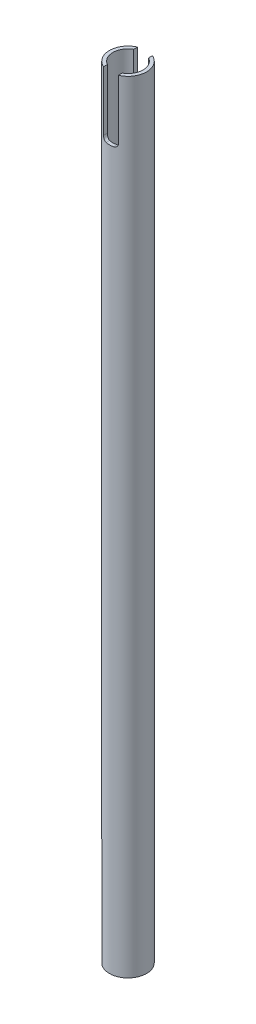
ISO-10303-21;
HEADER;
FILE_DESCRIPTION(('STEP AP214'),'2;1');
FILE_NAME('part.step','',(''),(''),'','','');
FILE_SCHEMA(('AUTOMOTIVE_DESIGN { 1 0 10303 214 1 1 1 1 }'));
ENDSEC;
DATA;
#1=APPLICATION_CONTEXT('core data for automotive mechanical design processes');
#2=APPLICATION_PROTOCOL_DEFINITION('international standard','automotive_design',2000,#1);
#3=PRODUCT_CONTEXT('',#1,'mechanical');
#4=PRODUCT('Part','Part','',(#3));
#5=PRODUCT_RELATED_PRODUCT_CATEGORY('part','',(#4));
#6=PRODUCT_DEFINITION_FORMATION('','',#4);
#7=PRODUCT_DEFINITION_CONTEXT('part definition',#1,'design');
#8=PRODUCT_DEFINITION('design','',#6,#7);
#9=PRODUCT_DEFINITION_SHAPE('','',#8);
#10=(LENGTH_UNIT() NAMED_UNIT(*) SI_UNIT(.MILLI.,.METRE.));
#11=(NAMED_UNIT(*) PLANE_ANGLE_UNIT() SI_UNIT($,.RADIAN.));
#12=(NAMED_UNIT(*) SI_UNIT($,.STERADIAN.) SOLID_ANGLE_UNIT());
#13=UNCERTAINTY_MEASURE_WITH_UNIT(LENGTH_MEASURE(1.E-05),#10,'distance_accuracy_value','');
#14=(GEOMETRIC_REPRESENTATION_CONTEXT(3) GLOBAL_UNCERTAINTY_ASSIGNED_CONTEXT((#13)) GLOBAL_UNIT_ASSIGNED_CONTEXT((#10,
#11,#12)) REPRESENTATION_CONTEXT('',''));
#15=CARTESIAN_POINT('',(0.,0.,0.));
#16=DIRECTION('',(0.,0.,1.));
#17=DIRECTION('',(1.,0.,0.));
#18=AXIS2_PLACEMENT_3D('',#15,#16,#17);
#19=CARTESIAN_POINT('',(3.175,170.145482761916,0.));
#20=DIRECTION('',(0.,1.,0.));
#21=DIRECTION('',(0.,0.,1.));
#22=AXIS2_PLACEMENT_3D('',#19,#20,#21);
#23=PLANE('',#22);
#24=DIRECTION('',(0.,0.,1.));
#25=VECTOR('',#24,1.);
#26=CARTESIAN_POINT('',(-3.175,170.145482761916,0.));
#27=LINE('',#26,#25);
#28=CARTESIAN_POINT('',(-3.175,170.145482761916,-7.2748389157424));
#29=VERTEX_POINT('',#28);
#30=CARTESIAN_POINT('',(-3.175,170.145482761916,-5.63085690548073));
#31=VERTEX_POINT('',#30);
#32=EDGE_CURVE('E173',#29,#31,#27,.T.);
#33=ORIENTED_EDGE('',*,*,#32,.F.);
#34=CARTESIAN_POINT('',(0.,170.145482761916,0.));
#35=DIRECTION('',(0.,1.,0.));
#36=DIRECTION('',(0.,0.,1.));
#37=AXIS2_PLACEMENT_3D('',#34,#35,#36);
#38=CIRCLE('',#37,7.9375);
#39=CARTESIAN_POINT('',(-3.175,170.145482761916,7.2748389157424));
#40=VERTEX_POINT('',#39);
#41=EDGE_CURVE('E151',#29,#40,#38,.T.);
#42=ORIENTED_EDGE('',*,*,#41,.T.);
#43=CARTESIAN_POINT('',(-3.175,170.145482761916,5.63085690548073));
#44=VERTEX_POINT('',#43);
#45=EDGE_CURVE('E171',#44,#40,#27,.T.);
#46=ORIENTED_EDGE('',*,*,#45,.F.);
#47=CARTESIAN_POINT('',(0.,170.145482761916,0.));
#48=DIRECTION('',(0.,1.,0.));
#49=DIRECTION('',(0.,0.,1.));
#50=AXIS2_PLACEMENT_3D('',#47,#48,#49);
#51=CIRCLE('',#50,6.4643);
#52=EDGE_CURVE('E169',#31,#44,#51,.T.);
#53=ORIENTED_EDGE('',*,*,#52,.F.);
#54=EDGE_LOOP('',(#33,#42,#46,#53));
#55=FACE_BOUND('',#54,.T.);
#56=ADVANCED_FACE('F37',(#55),#23,.T.);
#57=CARTESIAN_POINT('',(0.,217.996123064589,0.));
#58=DIRECTION('',(0.,-1.,0.));
#59=DIRECTION('',(0.,0.,-1.));
#60=AXIS2_PLACEMENT_3D('',#57,#58,#59);
#61=CYLINDRICAL_SURFACE('',#60,7.9375);
#62=CARTESIAN_POINT('',(0.,-163.416677555843,0.));
#63=DIRECTION('',(0.,1.,0.));
#64=DIRECTION('',(0.,0.,1.));
#65=AXIS2_PLACEMENT_3D('',#62,#63,#64);
#66=CIRCLE('',#65,7.9375);
#67=CARTESIAN_POINT('',(0.,-163.416677555843,7.9375));
#68=VERTEX_POINT('',#67);
#69=EDGE_CURVE('E154',#68,#68,#66,.T.);
#70=ORIENTED_EDGE('',*,*,#69,.T.);
#71=EDGE_LOOP('',(#70));
#72=FACE_BOUND('',#71,.T.);
#73=CARTESIAN_POINT('',(1.5875,143.157982761916,-7.77712993333659));
#74=CARTESIAN_POINT('',(1.63350676862772,143.157983005506,-7.76774126330065));
#75=CARTESIAN_POINT('',(1.67940359564176,143.159983666623,-7.75794444810862));
#76=CARTESIAN_POINT('',(1.77068039580911,143.167921029942,-7.73762089991974));
#77=CARTESIAN_POINT('',(1.81606050148704,143.17385669869,-7.72709435922088));
#78=CARTESIAN_POINT('',(1.95078228156833,143.197429647941,-7.6945984520111));
#79=CARTESIAN_POINT('',(2.03894812030822,143.220833594863,-7.6716629936863));
#80=CARTESIAN_POINT('',(2.20953807004376,143.282113792035,-7.62428385726794));
#81=CARTESIAN_POINT('',(2.29196515383515,143.319982482295,-7.59984097261638));
#82=CARTESIAN_POINT('',(2.44917385980105,143.409129752336,-7.55064502184107));
#83=CARTESIAN_POINT('',(2.52395227814499,143.460413919781,-7.52589183057165));
#84=CARTESIAN_POINT('',(2.66543932718694,143.576400967737,-7.47696931777062));
#85=CARTESIAN_POINT('',(2.73193883493113,143.641369692852,-7.4528241459836));
#86=CARTESIAN_POINT('',(2.85299322074861,143.782507906685,-7.40732925012122));
#87=CARTESIAN_POINT('',(2.90754767783193,143.858677790017,-7.38597962458242));
#88=CARTESIAN_POINT('',(3.00159155783955,144.018251490501,-7.34825600672415));
#89=CARTESIAN_POINT('',(3.04142452291151,144.101425945761,-7.33177064627855));
#90=CARTESIAN_POINT('',(3.10622330269326,144.274196577861,-7.30455577634143));
#91=CARTESIAN_POINT('',(3.13121458917044,144.36378145503,-7.2938164085495));
#92=CARTESIAN_POINT('',(3.157101940763,144.502829274798,-7.28263004031742));
#93=CARTESIAN_POINT('',(3.16380495831028,144.551084501638,-7.27971714426164));
#94=CARTESIAN_POINT('',(3.17275416759984,144.648043920068,-7.2758193784974));
#95=CARTESIAN_POINT('',(3.17500392571316,144.696747720986,-7.27483296598247));
#96=CARTESIAN_POINT('',(3.175,144.745482761916,-7.2748389157424));
#97=B_SPLINE_CURVE_WITH_KNOTS('',3,(#73,#74,#75,#76,#77,#78,#79,#80,#81,#82,#83,#84,#85,#86,#87,
#88,#89,#90,#91,#92,#93,#94,#95,#96),.UNSPECIFIED.,.F.,.F.,(4,2,2,2,2,2,2,2,2,2,2,4),(0.,
0.140770845296605,0.281504734514007,0.562238948643036,0.84282663751778,1.12353138019525,
1.41029752992662,1.69707378478449,1.97665708187305,2.255759151943,2.40195937855945,
2.54804247399295),.UNSPECIFIED.);
#98=CARTESIAN_POINT('',(1.5875,143.157982761916,-7.77712993333659));
#99=VERTEX_POINT('',#98);
#100=CARTESIAN_POINT('',(3.175,144.745482761916,-7.2748389157424));
#101=VERTEX_POINT('',#100);
#102=EDGE_CURVE('E147',#99,#101,#97,.T.);
#103=ORIENTED_EDGE('',*,*,#102,.T.);
#104=DIRECTION('',(0.,-1.,0.));
#105=VECTOR('',#104,1.);
#106=CARTESIAN_POINT('',(3.17499999999999,217.996123064589,-7.2748389157424));
#107=LINE('',#106,#105);
#108=CARTESIAN_POINT('',(3.175,170.145482761916,-7.2748389157424));
#109=VERTEX_POINT('',#108);
#110=EDGE_CURVE('E134',#101,#109,#107,.F.);
#111=ORIENTED_EDGE('',*,*,#110,.T.);
#112=CARTESIAN_POINT('',(3.175,170.145482761916,7.2748389157424));
#113=VERTEX_POINT('',#112);
#114=EDGE_CURVE('E141',#113,#109,#38,.T.);
#115=ORIENTED_EDGE('',*,*,#114,.F.);
#116=DIRECTION('',(0.,-1.,0.));
#117=VECTOR('',#116,1.);
#118=CARTESIAN_POINT('',(3.17499999999999,217.996123064589,7.2748389157424));
#119=LINE('',#118,#117);
#120=CARTESIAN_POINT('',(3.175,144.745482761916,7.2748389157424));
#121=VERTEX_POINT('',#120);
#122=EDGE_CURVE('E59',#113,#121,#119,.T.);
#123=ORIENTED_EDGE('',*,*,#122,.T.);
#124=CARTESIAN_POINT('',(3.175,144.745482761916,7.2748389157424));
#125=CARTESIAN_POINT('',(3.17500168113658,144.703111209934,7.27483586366098));
#126=CARTESIAN_POINT('',(3.17330245165568,144.66076151427,7.27558001702576));
#127=CARTESIAN_POINT('',(3.16653661877878,144.576395699801,7.278528185394));
#128=CARTESIAN_POINT('',(3.16147102917758,144.534379484419,7.28073176088512));
#129=CARTESIAN_POINT('',(3.14133450163409,144.409597126404,7.28945465778902));
#130=CARTESIAN_POINT('',(3.12132308750014,144.327716807314,7.29808678684577));
#131=CARTESIAN_POINT('',(3.06894040253672,144.168858919314,7.32026684625098));
#132=CARTESIAN_POINT('',(3.03657783085928,144.091877944127,7.3338113164125));
#133=CARTESIAN_POINT('',(2.96061234627717,143.944485363752,7.36480545430105));
#134=CARTESIAN_POINT('',(2.91700139314281,143.87407850691,7.38225791423852));
#135=CARTESIAN_POINT('',(2.81767453343917,143.738404218042,7.42075264717216));
#136=CARTESIAN_POINT('',(2.76150754869702,143.67350320828,7.44191980144858));
#137=CARTESIAN_POINT('',(2.63982081610505,143.553817684574,7.48594933347426));
#138=CARTESIAN_POINT('',(2.57429738653623,143.499037172558,7.50881237683833));
#139=CARTESIAN_POINT('',(2.43069507728355,143.397359785486,7.55656843444929));
#140=CARTESIAN_POINT('',(2.35206470826207,143.35125525651,7.58149355937878));
#141=CARTESIAN_POINT('',(2.18789362747881,143.273089652311,7.63048866953836));
#142=CARTESIAN_POINT('',(2.10235659094264,143.241021165704,7.65455909988382));
#143=CARTESIAN_POINT('',(1.94541809174972,143.197196170931,7.69573507431979));
#144=CARTESIAN_POINT('',(1.87491037842449,143.182561066085,7.71322855066071));
#145=CARTESIAN_POINT('',(1.7321911340129,143.162945304232,7.74654000063457));
#146=CARTESIAN_POINT('',(1.65997981118745,143.157963473268,7.76235817778308));
#147=CARTESIAN_POINT('',(1.5875,143.157982761916,7.77712993333659));
#148=B_SPLINE_CURVE_WITH_KNOTS('',3,(#124,#125,#126,#127,#128,#129,#130,#131,#132,#133,#134,
#135,#136,#137,#138,#139,#140,#141,#142,#143,#144,#145,#146,#147),.UNSPECIFIED.,.F.,.F.,(4,2,2,
2,2,2,2,2,2,2,2,4),(0.,0.127031494291915,0.254024749792407,0.506885265042619,0.75956801357504,
1.01243188015942,1.27651034681324,1.54069301498292,1.82289095795796,2.10493971303586,
2.32661111398097,2.54825555529031),.UNSPECIFIED.);
#149=CARTESIAN_POINT('',(1.5875,143.157982761916,7.77712993333659));
#150=VERTEX_POINT('',#149);
#151=EDGE_CURVE('E157',#121,#150,#148,.T.);
#152=ORIENTED_EDGE('',*,*,#151,.T.);
#153=CARTESIAN_POINT('',(0.,143.157982761916,0.));
#154=DIRECTION('',(0.,-1.,0.));
#155=DIRECTION('',(0.,0.,-1.));
#156=AXIS2_PLACEMENT_3D('',#153,#154,#155);
#157=CIRCLE('',#156,7.9375);
#158=CARTESIAN_POINT('',(-1.5875,143.157982761916,7.77712993333659));
#159=VERTEX_POINT('',#158);
#160=EDGE_CURVE('E223',#150,#159,#157,.T.);
#161=ORIENTED_EDGE('',*,*,#160,.T.);
#162=CARTESIAN_POINT('',(-1.5875,143.157982761916,7.77712993333659));
#163=CARTESIAN_POINT('',(-1.63350676862772,143.157983005506,7.76774126330065));
#164=CARTESIAN_POINT('',(-1.67940359564176,143.159983666623,7.75794444810862));
#165=CARTESIAN_POINT('',(-1.77068039580911,143.167921029942,7.73762089991974));
#166=CARTESIAN_POINT('',(-1.81606050148704,143.17385669869,7.72709435922088));
#167=CARTESIAN_POINT('',(-1.95078228156832,143.197429647941,7.6945984520111));
#168=CARTESIAN_POINT('',(-2.03894812030822,143.220833594863,7.6716629936863));
#169=CARTESIAN_POINT('',(-2.20953807004376,143.282113792035,7.62428385726794));
#170=CARTESIAN_POINT('',(-2.29196515383515,143.319982482295,7.59984097261638));
#171=CARTESIAN_POINT('',(-2.44917385980105,143.409129752336,7.55064502184107));
#172=CARTESIAN_POINT('',(-2.52395227814499,143.460413919781,7.52589183057165));
#173=CARTESIAN_POINT('',(-2.66543932718694,143.576400967737,7.47696931777062));
#174=CARTESIAN_POINT('',(-2.73193883493113,143.641369692852,7.4528241459836));
#175=CARTESIAN_POINT('',(-2.85299322074861,143.782507906685,7.40732925012122));
#176=CARTESIAN_POINT('',(-2.90754767783192,143.858677790017,7.38597962458243));
#177=CARTESIAN_POINT('',(-3.00159155783955,144.018251490501,7.34825600672415));
#178=CARTESIAN_POINT('',(-3.04142452291151,144.101425945761,7.33177064627855));
#179=CARTESIAN_POINT('',(-3.10622330269325,144.274196577861,7.30455577634144));
#180=CARTESIAN_POINT('',(-3.13121458917044,144.36378145503,7.2938164085495));
#181=CARTESIAN_POINT('',(-3.157101940763,144.502829274798,7.28263004031742));
#182=CARTESIAN_POINT('',(-3.16380495831028,144.551084501638,7.27971714426164));
#183=CARTESIAN_POINT('',(-3.17275416759984,144.648043920068,7.27581937849741));
#184=CARTESIAN_POINT('',(-3.17500392571315,144.696747720986,7.27483296598248));
#185=CARTESIAN_POINT('',(-3.17499999999999,144.745482761916,7.2748389157424));
#186=B_SPLINE_CURVE_WITH_KNOTS('',3,(#162,#163,#164,#165,#166,#167,#168,#169,#170,#171,#172,
#173,#174,#175,#176,#177,#178,#179,#180,#181,#182,#183,#184,#185),.UNSPECIFIED.,.F.,.F.,(4,2,2,
2,2,2,2,2,2,2,2,4),(0.,0.140770845296605,0.281504734514007,0.562238948643036,0.842826637517781,
1.12353138019525,1.41029752992662,1.69707378478449,1.97665708187305,2.255759151943,
2.40195937855945,2.54804247399295),.UNSPECIFIED.);
#187=CARTESIAN_POINT('',(-3.17499999999999,144.745482761916,7.2748389157424));
#188=VERTEX_POINT('',#187);
#189=EDGE_CURVE('E213',#159,#188,#186,.T.);
#190=ORIENTED_EDGE('',*,*,#189,.T.);
#191=DIRECTION('',(0.,-1.,0.));
#192=VECTOR('',#191,1.);
#193=CARTESIAN_POINT('',(-3.175,217.996123064589,7.2748389157424));
#194=LINE('',#193,#192);
#195=EDGE_CURVE('E277',#188,#40,#194,.F.);
#196=ORIENTED_EDGE('',*,*,#195,.T.);
#197=ORIENTED_EDGE('',*,*,#41,.F.);
#198=DIRECTION('',(0.,-1.,0.));
#199=VECTOR('',#198,1.);
#200=CARTESIAN_POINT('',(-3.175,217.996123064589,-7.2748389157424));
#201=LINE('',#200,#199);
#202=CARTESIAN_POINT('',(-3.17499999999999,144.745482761916,-7.2748389157424));
#203=VERTEX_POINT('',#202);
#204=EDGE_CURVE('E214',#29,#203,#201,.T.);
#205=ORIENTED_EDGE('',*,*,#204,.T.);
#206=CARTESIAN_POINT('',(-3.17499999999999,144.745482761916,-7.2748389157424));
#207=CARTESIAN_POINT('',(-3.17500168113658,144.703111209934,-7.27483586366098));
#208=CARTESIAN_POINT('',(-3.17330245165568,144.66076151427,-7.27558001702576));
#209=CARTESIAN_POINT('',(-3.16653661877878,144.576395699801,-7.278528185394));
#210=CARTESIAN_POINT('',(-3.16147102917758,144.534379484419,-7.28073176088511));
#211=CARTESIAN_POINT('',(-3.14133450163409,144.409597126404,-7.28945465778902));
#212=CARTESIAN_POINT('',(-3.12132308750014,144.327716807314,-7.29808678684577));
#213=CARTESIAN_POINT('',(-3.06894040253672,144.168858919314,-7.32026684625099));
#214=CARTESIAN_POINT('',(-3.03657783085928,144.091877944127,-7.3338113164125));
#215=CARTESIAN_POINT('',(-2.96061234627717,143.944485363752,-7.36480545430105));
#216=CARTESIAN_POINT('',(-2.91700139314281,143.87407850691,-7.38225791423852));
#217=CARTESIAN_POINT('',(-2.81767453343916,143.738404218042,-7.42075264717216));
#218=CARTESIAN_POINT('',(-2.76150754869701,143.67350320828,-7.44191980144858));
#219=CARTESIAN_POINT('',(-2.63982081610505,143.553817684574,-7.48594933347426));
#220=CARTESIAN_POINT('',(-2.57429738653623,143.499037172558,-7.50881237683833));
#221=CARTESIAN_POINT('',(-2.43069507728355,143.397359785486,-7.55656843444929));
#222=CARTESIAN_POINT('',(-2.35206470826206,143.35125525651,-7.58149355937878));
#223=CARTESIAN_POINT('',(-2.18789362747881,143.273089652311,-7.63048866953836));
#224=CARTESIAN_POINT('',(-2.10235659094263,143.241021165704,-7.65455909988382));
#225=CARTESIAN_POINT('',(-1.94541809174972,143.197196170931,-7.69573507431979));
#226=CARTESIAN_POINT('',(-1.87491037842449,143.182561066085,-7.71322855066071));
#227=CARTESIAN_POINT('',(-1.73219113401289,143.162945304232,-7.74654000063457));
#228=CARTESIAN_POINT('',(-1.65997981118744,143.157963473268,-7.76235817778308));
#229=CARTESIAN_POINT('',(-1.5875,143.157982761916,-7.77712993333659));
#230=B_SPLINE_CURVE_WITH_KNOTS('',3,(#206,#207,#208,#209,#210,#211,#212,#213,#214,#215,#216,
#217,#218,#219,#220,#221,#222,#223,#224,#225,#226,#227,#228,#229),.UNSPECIFIED.,.F.,.F.,(4,2,2,
2,2,2,2,2,2,2,2,4),(0.,0.127031494291915,0.254024749792407,0.506885265042619,0.75956801357504,
1.01243188015942,1.27651034681324,1.54069301498292,1.82289095795796,2.10493971303586,
2.32661111398096,2.54825555529031),.UNSPECIFIED.);
#231=CARTESIAN_POINT('',(-1.5875,143.157982761916,-7.77712993333659));
#232=VERTEX_POINT('',#231);
#233=EDGE_CURVE('E206',#203,#232,#230,.T.);
#234=ORIENTED_EDGE('',*,*,#233,.T.);
#235=EDGE_CURVE('E222',#232,#99,#157,.T.);
#236=ORIENTED_EDGE('',*,*,#235,.T.);
#237=EDGE_LOOP('',(#103,#111,#115,#123,#152,#161,#190,#196,#197,#205,#234,#236));
#238=FACE_BOUND('',#237,.T.);
#239=ADVANCED_FACE('F39',(#72,#238),#61,.T.);
#240=CARTESIAN_POINT('',(0.,-163.416677555843,0.));
#241=DIRECTION('',(0.,1.,0.));
#242=DIRECTION('',(0.,0.,1.));
#243=AXIS2_PLACEMENT_3D('',#240,#241,#242);
#244=PLANE('',#243);
#245=ORIENTED_EDGE('',*,*,#69,.F.);
#246=EDGE_LOOP('',(#245));
#247=FACE_BOUND('',#246,.T.);
#248=CARTESIAN_POINT('',(0.,-163.416677555843,0.));
#249=DIRECTION('',(0.,1.,0.));
#250=DIRECTION('',(0.,0.,1.));
#251=AXIS2_PLACEMENT_3D('',#248,#249,#250);
#252=CIRCLE('',#251,6.4643);
#253=CARTESIAN_POINT('',(0.,-163.416677555843,6.4643));
#254=VERTEX_POINT('',#253);
#255=EDGE_CURVE('E163',#254,#254,#252,.T.);
#256=ORIENTED_EDGE('',*,*,#255,.T.);
#257=EDGE_LOOP('',(#256));
#258=FACE_BOUND('',#257,.T.);
#259=ADVANCED_FACE('F312',(#247,#258),#244,.F.);
#260=CARTESIAN_POINT('',(0.,217.996123064589,0.));
#261=DIRECTION('',(0.,-1.,0.));
#262=DIRECTION('',(0.,0.,-1.));
#263=AXIS2_PLACEMENT_3D('',#260,#261,#262);
#264=CYLINDRICAL_SURFACE('',#263,6.4643);
#265=DIRECTION('',(0.,-1.,0.));
#266=VECTOR('',#265,1.);
#267=CARTESIAN_POINT('',(-3.175,217.996123064589,5.63085690548073));
#268=LINE('',#267,#266);
#269=CARTESIAN_POINT('',(-3.17499999999999,144.745482761916,5.63085690548073));
#270=VERTEX_POINT('',#269);
#271=EDGE_CURVE('E270',#270,#44,#268,.F.);
#272=ORIENTED_EDGE('',*,*,#271,.F.);
#273=CARTESIAN_POINT('',(-1.5875,143.157982761916,6.26634009929241));
#274=CARTESIAN_POINT('',(-1.63418900680278,143.157982983331,6.25451519937794));
#275=CARTESIAN_POINT('',(-1.68071621150091,143.160043275872,6.2421690242475));
#276=CARTESIAN_POINT('',(-1.77313930969813,143.168191687556,6.21654599792506));
#277=CARTESIAN_POINT('',(-1.81903543834437,143.174278262522,6.20326950527711));
#278=CARTESIAN_POINT('',(-1.95507469082072,143.198389186271,6.16228683989147));
#279=CARTESIAN_POINT('',(-2.04387534201677,143.222266005209,6.13334935224697));
#280=CARTESIAN_POINT('',(-2.21532061503981,143.284550711556,6.07353181019978));
#281=CARTESIAN_POINT('',(-2.29797173444354,143.322942993338,6.04265387160463));
#282=CARTESIAN_POINT('',(-2.45546303738963,143.413177947232,5.98038883139863));
#283=CARTESIAN_POINT('',(-2.53029702370294,143.465031179053,5.94900134826912));
#284=CARTESIAN_POINT('',(-2.67287075398232,143.583154895925,5.88635884745835));
#285=CARTESIAN_POINT('',(-2.74025626996521,143.649878781564,5.8551496317366));
#286=CARTESIAN_POINT('',(-2.86271368076047,143.795216042936,5.79626340236598));
#287=CARTESIAN_POINT('',(-2.91778558227083,143.873829412201,5.76858638679578));
#288=CARTESIAN_POINT('',(-3.01168872656627,144.038051346447,5.72010524984433));
#289=CARTESIAN_POINT('',(-3.05104502216773,144.123293949787,5.6990849029132));
#290=CARTESIAN_POINT('',(-3.11430373465244,144.300694744266,5.66476886814872));
#291=CARTESIAN_POINT('',(-3.13824572360375,144.392834543609,5.6514534090763));
#292=CARTESIAN_POINT('',(-3.16081362599345,144.529327551484,5.63883740321027));
#293=CARTESIAN_POINT('',(-3.16612512648615,144.57233629855,5.63585394797715));
#294=CARTESIAN_POINT('',(-3.17321828948629,144.658714339154,5.63186201493138));
#295=CARTESIAN_POINT('',(-3.17500157254309,144.702083457973,5.63085263040865));
#296=CARTESIAN_POINT('',(-3.17499999999999,144.745482761916,5.63085690548073));
#297=B_SPLINE_CURVE_WITH_KNOTS('',3,(#273,#274,#275,#276,#277,#278,#279,#280,#281,#282,#283,
#284,#285,#286,#287,#288,#289,#290,#291,#292,#293,#294,#295,#296),.UNSPECIFIED.,.F.,.F.,(4,2,2,
2,2,2,2,2,2,2,2,4),(0.,0.144388740940303,0.288722137366159,0.576452128922374,0.86387365648991,
1.15152134248761,1.44956694911562,1.7476123936214,2.03464137858753,2.32093052452343,
2.45108160789035,2.58117289753274),.UNSPECIFIED.);
#298=CARTESIAN_POINT('',(-1.5875,143.157982761916,6.26634009929241));
#299=VERTEX_POINT('',#298);
#300=EDGE_CURVE('E200',#299,#270,#297,.T.);
#301=ORIENTED_EDGE('',*,*,#300,.F.);
#302=CARTESIAN_POINT('',(0.,143.157982761916,0.));
#303=DIRECTION('',(0.,-1.,0.));
#304=DIRECTION('',(0.,0.,-1.));
#305=AXIS2_PLACEMENT_3D('',#302,#303,#304);
#306=CIRCLE('',#305,6.4643);
#307=CARTESIAN_POINT('',(1.5875,143.157982761916,6.26634009929241));
#308=VERTEX_POINT('',#307);
#309=EDGE_CURVE('E52',#308,#299,#306,.T.);
#310=ORIENTED_EDGE('',*,*,#309,.F.);
#311=CARTESIAN_POINT('',(3.175,144.745482761916,5.63085690548073));
#312=CARTESIAN_POINT('',(3.1750026594243,144.704325931241,5.63085243150939));
#313=CARTESIAN_POINT('',(3.17339835018605,144.663191409066,5.63176028239597));
#314=CARTESIAN_POINT('',(3.16701766507687,144.581265593726,5.6353521570195));
#315=CARTESIAN_POINT('',(3.1622427330513,144.540474152885,5.63803537228504));
#316=CARTESIAN_POINT('',(3.14329664507894,144.419478926111,5.64863522411123));
#317=CARTESIAN_POINT('',(3.12450305374455,144.34016687367,5.65910325483872));
#318=CARTESIAN_POINT('',(3.0754916504055,144.186416979172,5.68588522764517));
#319=CARTESIAN_POINT('',(3.04528974537461,144.111972518852,5.7021910282914));
#320=CARTESIAN_POINT('',(2.97460119282057,143.969304897856,5.73938277272117));
#321=CARTESIAN_POINT('',(2.93410271969422,143.901089013965,5.76027397904373));
#322=CARTESIAN_POINT('',(2.84103773378422,143.767811045705,5.80676804025646));
#323=CARTESIAN_POINT('',(2.78784532739573,143.703264883643,5.83259254506421));
#324=CARTESIAN_POINT('',(2.67254263369961,143.583698173605,5.88631786935968));
#325=CARTESIAN_POINT('',(2.61042818908352,143.528682092771,5.91421965383983));
#326=CARTESIAN_POINT('',(2.47143371409536,143.423665244464,5.97373371686978));
#327=CARTESIAN_POINT('',(2.39368295701583,143.374854824908,6.00542032126396));
#328=CARTESIAN_POINT('',(2.23068225215682,143.291227426858,6.06785364975219));
#329=CARTESIAN_POINT('',(2.14543609512392,143.256403423885,6.09860083846705));
#330=CARTESIAN_POINT('',(1.98216120584024,143.205806150253,6.15341243852267));
#331=CARTESIAN_POINT('',(1.90486553835027,143.188009239317,6.17780100436402));
#332=CARTESIAN_POINT('',(1.74771289593288,143.164080071508,6.22410888754503));
#333=CARTESIAN_POINT('',(1.66785396509172,143.157956948424,6.24602625877211));
#334=CARTESIAN_POINT('',(1.5875,143.157982761916,6.26634009929241));
#335=B_SPLINE_CURVE_WITH_KNOTS('',3,(#311,#312,#313,#314,#315,#316,#317,#318,#319,#320,#321,
#322,#323,#324,#325,#326,#327,#328,#329,#330,#331,#332,#333,#334),.UNSPECIFIED.,.F.,.F.,(4,2,2,
2,2,2,2,2,2,2,2,4),(0.,0.123386261727151,0.246716374037833,0.491934980105682,0.736812924701823,
0.981973392060152,1.24352761602776,1.50520411142376,1.79524970866348,2.08514945193372,
2.33322496948236,2.58149450643057),.UNSPECIFIED.);
#336=CARTESIAN_POINT('',(3.175,144.745482761916,5.63085690548073));
#337=VERTEX_POINT('',#336);
#338=EDGE_CURVE('E12',#337,#308,#335,.T.);
#339=ORIENTED_EDGE('',*,*,#338,.F.);
#340=DIRECTION('',(0.,-1.,0.));
#341=VECTOR('',#340,1.);
#342=CARTESIAN_POINT('',(3.17499999999999,217.996123064589,5.63085690548073));
#343=LINE('',#342,#341);
#344=CARTESIAN_POINT('',(3.175,170.145482761916,5.63085690548073));
#345=VERTEX_POINT('',#344);
#346=EDGE_CURVE('E148',#345,#337,#343,.T.);
#347=ORIENTED_EDGE('',*,*,#346,.F.);
#348=CARTESIAN_POINT('',(3.175,170.145482761916,-5.63085690548073));
#349=VERTEX_POINT('',#348);
#350=EDGE_CURVE('E166',#345,#349,#51,.T.);
#351=ORIENTED_EDGE('',*,*,#350,.T.);
#352=DIRECTION('',(0.,-1.,0.));
#353=VECTOR('',#352,1.);
#354=CARTESIAN_POINT('',(3.17499999999999,217.996123064589,-5.63085690548073));
#355=LINE('',#354,#353);
#356=CARTESIAN_POINT('',(3.175,144.745482761916,-5.63085690548073));
#357=VERTEX_POINT('',#356);
#358=EDGE_CURVE('E67',#357,#349,#355,.F.);
#359=ORIENTED_EDGE('',*,*,#358,.F.);
#360=CARTESIAN_POINT('',(1.5875,143.157982761916,-6.26634009929241));
#361=CARTESIAN_POINT('',(1.63418900680279,143.157982983331,-6.25451519937794));
#362=CARTESIAN_POINT('',(1.68071621150091,143.160043275872,-6.2421690242475));
#363=CARTESIAN_POINT('',(1.77313930969814,143.168191687556,-6.21654599792506));
#364=CARTESIAN_POINT('',(1.81903543834437,143.174278262522,-6.20326950527711));
#365=CARTESIAN_POINT('',(1.95507469082073,143.198389186271,-6.16228683989147));
#366=CARTESIAN_POINT('',(2.04387534201678,143.222266005209,-6.13334935224697));
#367=CARTESIAN_POINT('',(2.21532061503982,143.284550711556,-6.07353181019978));
#368=CARTESIAN_POINT('',(2.29797173444355,143.322942993338,-6.04265387160463));
#369=CARTESIAN_POINT('',(2.45546303738964,143.413177947232,-5.98038883139863));
#370=CARTESIAN_POINT('',(2.53029702370295,143.465031179053,-5.94900134826912));
#371=CARTESIAN_POINT('',(2.67287075398233,143.583154895925,-5.88635884745835));
#372=CARTESIAN_POINT('',(2.74025626996522,143.649878781564,-5.85514963173659));
#373=CARTESIAN_POINT('',(2.86271368076048,143.795216042936,-5.79626340236598));
#374=CARTESIAN_POINT('',(2.91778558227083,143.873829412201,-5.76858638679578));
#375=CARTESIAN_POINT('',(3.01168872656628,144.038051346447,-5.72010524984433));
#376=CARTESIAN_POINT('',(3.05104502216773,144.123293949787,-5.6990849029132));
#377=CARTESIAN_POINT('',(3.11430373465244,144.300694744266,-5.66476886814871));
#378=CARTESIAN_POINT('',(3.13824572360375,144.392834543609,-5.6514534090763));
#379=CARTESIAN_POINT('',(3.16081362599346,144.529327551484,-5.63883740321027));
#380=CARTESIAN_POINT('',(3.16612512648615,144.57233629855,-5.63585394797714));
#381=CARTESIAN_POINT('',(3.1732182894863,144.658714339154,-5.63186201493137));
#382=CARTESIAN_POINT('',(3.17500157254309,144.702083457973,-5.63085263040865));
#383=CARTESIAN_POINT('',(3.175,144.745482761916,-5.63085690548073));
#384=B_SPLINE_CURVE_WITH_KNOTS('',3,(#360,#361,#362,#363,#364,#365,#366,#367,#368,#369,#370,
#371,#372,#373,#374,#375,#376,#377,#378,#379,#380,#381,#382,#383),.UNSPECIFIED.,.F.,.F.,(4,2,2,
2,2,2,2,2,2,2,2,4),(0.,0.144388740940303,0.288722137366159,0.576452128922374,0.86387365648991,
1.15152134248761,1.44956694911562,1.7476123936214,2.03464137858753,2.32093052452343,
2.45108160789035,2.58117289753274),.UNSPECIFIED.);
#385=CARTESIAN_POINT('',(1.5875,143.157982761916,-6.26634009929241));
#386=VERTEX_POINT('',#385);
#387=EDGE_CURVE('E237',#386,#357,#384,.T.);
#388=ORIENTED_EDGE('',*,*,#387,.F.);
#389=CARTESIAN_POINT('',(-1.5875,143.157982761916,-6.26634009929241));
#390=VERTEX_POINT('',#389);
#391=EDGE_CURVE('E181',#390,#386,#306,.T.);
#392=ORIENTED_EDGE('',*,*,#391,.F.);
#393=CARTESIAN_POINT('',(-3.17499999999999,144.745482761916,-5.63085690548073));
#394=CARTESIAN_POINT('',(-3.1750026594243,144.704325931241,-5.6308524315094));
#395=CARTESIAN_POINT('',(-3.17339835018605,144.663191409066,-5.63176028239597));
#396=CARTESIAN_POINT('',(-3.16701766507686,144.581265593726,-5.6353521570195));
#397=CARTESIAN_POINT('',(-3.1622427330513,144.540474152885,-5.63803537228504));
#398=CARTESIAN_POINT('',(-3.14329664507894,144.419478926111,-5.64863522411122));
#399=CARTESIAN_POINT('',(-3.12450305374455,144.34016687367,-5.65910325483872));
#400=CARTESIAN_POINT('',(-3.07549165040549,144.186416979172,-5.68588522764517));
#401=CARTESIAN_POINT('',(-3.0452897453746,144.111972518852,-5.70219102829141));
#402=CARTESIAN_POINT('',(-2.97460119282055,143.969304897856,-5.73938277272118));
#403=CARTESIAN_POINT('',(-2.93410271969421,143.901089013965,-5.76027397904373));
#404=CARTESIAN_POINT('',(-2.84103773378421,143.767811045705,-5.80676804025646));
#405=CARTESIAN_POINT('',(-2.78784532739572,143.703264883643,-5.83259254506421));
#406=CARTESIAN_POINT('',(-2.67254263369961,143.583698173605,-5.88631786935968));
#407=CARTESIAN_POINT('',(-2.61042818908352,143.528682092771,-5.91421965383983));
#408=CARTESIAN_POINT('',(-2.47143371409535,143.423665244464,-5.97373371686978));
#409=CARTESIAN_POINT('',(-2.39368295701582,143.374854824908,-6.00542032126396));
#410=CARTESIAN_POINT('',(-2.23068225215682,143.291227426858,-6.06785364975219));
#411=CARTESIAN_POINT('',(-2.14543609512392,143.256403423885,-6.09860083846706));
#412=CARTESIAN_POINT('',(-1.98216120584024,143.205806150253,-6.15341243852267));
#413=CARTESIAN_POINT('',(-1.90486553835027,143.188009239317,-6.17780100436402));
#414=CARTESIAN_POINT('',(-1.74771289593288,143.164080071508,-6.22410888754503));
#415=CARTESIAN_POINT('',(-1.66785396509172,143.157956948424,-6.24602625877211));
#416=CARTESIAN_POINT('',(-1.5875,143.157982761916,-6.26634009929241));
#417=B_SPLINE_CURVE_WITH_KNOTS('',3,(#393,#394,#395,#396,#397,#398,#399,#400,#401,#402,#403,
#404,#405,#406,#407,#408,#409,#410,#411,#412,#413,#414,#415,#416),.UNSPECIFIED.,.F.,.F.,(4,2,2,
2,2,2,2,2,2,2,2,4),(0.,0.123386261727151,0.246716374037805,0.491934980105682,0.736812924701854,
0.981973392060152,1.24352761602776,1.50520411142376,1.79524970866348,2.08514945193372,
2.33322496948236,2.58149450643056),.UNSPECIFIED.);
#418=CARTESIAN_POINT('',(-3.17499999999999,144.745482761916,-5.63085690548073));
#419=VERTEX_POINT('',#418);
#420=EDGE_CURVE('E174',#419,#390,#417,.T.);
#421=ORIENTED_EDGE('',*,*,#420,.F.);
#422=DIRECTION('',(0.,-1.,0.));
#423=VECTOR('',#422,1.);
#424=CARTESIAN_POINT('',(-3.175,217.996123064589,-5.63085690548073));
#425=LINE('',#424,#423);
#426=EDGE_CURVE('E275',#31,#419,#425,.T.);
#427=ORIENTED_EDGE('',*,*,#426,.F.);
#428=ORIENTED_EDGE('',*,*,#52,.T.);
#429=EDGE_LOOP('',(#272,#301,#310,#339,#347,#351,#359,#388,#392,#421,#427,#428));
#430=FACE_BOUND('',#429,.T.);
#431=ORIENTED_EDGE('',*,*,#255,.F.);
#432=EDGE_LOOP('',(#431));
#433=FACE_BOUND('',#432,.T.);
#434=ADVANCED_FACE('F183',(#430,#433),#264,.F.);
#435=DIRECTION('',(0.,0.,-1.));
#436=VECTOR('',#435,1.);
#437=CARTESIAN_POINT('',(3.175,170.145482761916,0.));
#438=LINE('',#437,#436);
#439=EDGE_CURVE('E140',#113,#345,#438,.T.);
#440=ORIENTED_EDGE('',*,*,#439,.F.);
#441=ORIENTED_EDGE('',*,*,#114,.T.);
#442=EDGE_CURVE('E131',#349,#109,#438,.T.);
#443=ORIENTED_EDGE('',*,*,#442,.F.);
#444=ORIENTED_EDGE('',*,*,#350,.F.);
#445=EDGE_LOOP('',(#440,#441,#443,#444));
#446=FACE_BOUND('',#445,.T.);
#447=ADVANCED_FACE('F150',(#446),#23,.T.);
#448=CARTESIAN_POINT('',(3.175,170.145482761916,-7.9375));
#449=DIRECTION('',(1.,0.,0.));
#450=DIRECTION('',(0.,1.,0.));
#451=AXIS2_PLACEMENT_3D('',#448,#449,#450);
#452=PLANE('',#451);
#453=DIRECTION('',(0.,0.,1.));
#454=VECTOR('',#453,1.);
#455=CARTESIAN_POINT('',(3.175,144.745482761916,-7.9375));
#456=LINE('',#455,#454);
#457=EDGE_CURVE('E292',#101,#357,#456,.T.);
#458=ORIENTED_EDGE('',*,*,#457,.T.);
#459=ORIENTED_EDGE('',*,*,#358,.T.);
#460=ORIENTED_EDGE('',*,*,#442,.T.);
#461=ORIENTED_EDGE('',*,*,#110,.F.);
#462=EDGE_LOOP('',(#458,#459,#460,#461));
#463=FACE_BOUND('',#462,.T.);
#464=ADVANCED_FACE('F133',(#463),#452,.F.);
#465=CARTESIAN_POINT('',(-3.175,170.145482761916,-7.9375));
#466=DIRECTION('',(-1.,0.,0.));
#467=DIRECTION('',(0.,-1.,0.));
#468=AXIS2_PLACEMENT_3D('',#465,#466,#467);
#469=PLANE('',#468);
#470=ORIENTED_EDGE('',*,*,#32,.T.);
#471=ORIENTED_EDGE('',*,*,#426,.T.);
#472=DIRECTION('',(0.,0.,1.));
#473=VECTOR('',#472,1.);
#474=CARTESIAN_POINT('',(-3.17499999999999,144.745482761916,-7.9375));
#475=LINE('',#474,#473);
#476=EDGE_CURVE('E265',#203,#419,#475,.T.);
#477=ORIENTED_EDGE('',*,*,#476,.F.);
#478=ORIENTED_EDGE('',*,*,#204,.F.);
#479=EDGE_LOOP('',(#470,#471,#477,#478));
#480=FACE_BOUND('',#479,.T.);
#481=ADVANCED_FACE('F195',(#480),#469,.F.);
#482=CARTESIAN_POINT('',(-1.5875,144.745482761916,-7.9375));
#483=DIRECTION('',(0.,0.,1.));
#484=DIRECTION('',(1.,0.,0.));
#485=AXIS2_PLACEMENT_3D('',#482,#483,#484);
#486=CYLINDRICAL_SURFACE('',#485,1.5875);
#487=ORIENTED_EDGE('',*,*,#476,.T.);
#488=ORIENTED_EDGE('',*,*,#420,.T.);
#489=DIRECTION('',(0.,0.,1.));
#490=VECTOR('',#489,1.);
#491=CARTESIAN_POINT('',(-1.5875,143.157982761916,-7.9375));
#492=LINE('',#491,#490);
#493=EDGE_CURVE('E264',#232,#390,#492,.T.);
#494=ORIENTED_EDGE('',*,*,#493,.F.);
#495=ORIENTED_EDGE('',*,*,#233,.F.);
#496=EDGE_LOOP('',(#487,#488,#494,#495));
#497=FACE_BOUND('',#496,.T.);
#498=ADVANCED_FACE('F194',(#497),#486,.F.);
#499=CARTESIAN_POINT('',(-1.5875,143.157982761916,-7.9375));
#500=DIRECTION('',(0.,-1.,0.));
#501=DIRECTION('',(0.,0.,-1.));
#502=AXIS2_PLACEMENT_3D('',#499,#500,#501);
#503=PLANE('',#502);
#504=ORIENTED_EDGE('',*,*,#235,.F.);
#505=ORIENTED_EDGE('',*,*,#493,.T.);
#506=ORIENTED_EDGE('',*,*,#391,.T.);
#507=DIRECTION('',(0.,0.,1.));
#508=VECTOR('',#507,1.);
#509=CARTESIAN_POINT('',(1.5875,143.157982761916,-7.9375));
#510=LINE('',#509,#508);
#511=EDGE_CURVE('E293',#99,#386,#510,.T.);
#512=ORIENTED_EDGE('',*,*,#511,.F.);
#513=EDGE_LOOP('',(#504,#505,#506,#512));
#514=FACE_BOUND('',#513,.T.);
#515=ADVANCED_FACE('F303',(#514),#503,.F.);
#516=CARTESIAN_POINT('',(1.5875,144.745482761916,-7.9375));
#517=DIRECTION('',(0.,0.,1.));
#518=DIRECTION('',(1.,0.,0.));
#519=AXIS2_PLACEMENT_3D('',#516,#517,#518);
#520=CYLINDRICAL_SURFACE('',#519,1.5875);
#521=ORIENTED_EDGE('',*,*,#511,.T.);
#522=ORIENTED_EDGE('',*,*,#387,.T.);
#523=ORIENTED_EDGE('',*,*,#457,.F.);
#524=ORIENTED_EDGE('',*,*,#102,.F.);
#525=EDGE_LOOP('',(#521,#522,#523,#524));
#526=FACE_BOUND('',#525,.T.);
#527=ADVANCED_FACE('F232',(#526),#520,.F.);
#528=EDGE_CURVE('E290',#337,#121,#456,.T.);
#529=ORIENTED_EDGE('',*,*,#528,.F.);
#530=ORIENTED_EDGE('',*,*,#338,.T.);
#531=EDGE_CURVE('E257',#308,#150,#510,.T.);
#532=ORIENTED_EDGE('',*,*,#531,.T.);
#533=ORIENTED_EDGE('',*,*,#151,.F.);
#534=EDGE_LOOP('',(#529,#530,#532,#533));
#535=FACE_BOUND('',#534,.T.);
#536=ADVANCED_FACE('F228',(#535),#520,.F.);
#537=ORIENTED_EDGE('',*,*,#531,.F.);
#538=ORIENTED_EDGE('',*,*,#309,.T.);
#539=EDGE_CURVE('E255',#299,#159,#492,.T.);
#540=ORIENTED_EDGE('',*,*,#539,.T.);
#541=ORIENTED_EDGE('',*,*,#160,.F.);
#542=EDGE_LOOP('',(#537,#538,#540,#541));
#543=FACE_BOUND('',#542,.T.);
#544=ADVANCED_FACE('F192',(#543),#503,.F.);
#545=ORIENTED_EDGE('',*,*,#539,.F.);
#546=ORIENTED_EDGE('',*,*,#300,.T.);
#547=EDGE_CURVE('E297',#270,#188,#475,.T.);
#548=ORIENTED_EDGE('',*,*,#547,.T.);
#549=ORIENTED_EDGE('',*,*,#189,.F.);
#550=EDGE_LOOP('',(#545,#546,#548,#549));
#551=FACE_BOUND('',#550,.T.);
#552=ADVANCED_FACE('F186',(#551),#486,.F.);
#553=ORIENTED_EDGE('',*,*,#547,.F.);
#554=ORIENTED_EDGE('',*,*,#271,.T.);
#555=ORIENTED_EDGE('',*,*,#45,.T.);
#556=ORIENTED_EDGE('',*,*,#195,.F.);
#557=EDGE_LOOP('',(#553,#554,#555,#556));
#558=FACE_BOUND('',#557,.T.);
#559=ADVANCED_FACE('F191',(#558),#469,.F.);
#560=ORIENTED_EDGE('',*,*,#439,.T.);
#561=ORIENTED_EDGE('',*,*,#346,.T.);
#562=ORIENTED_EDGE('',*,*,#528,.T.);
#563=ORIENTED_EDGE('',*,*,#122,.F.);
#564=EDGE_LOOP('',(#560,#561,#562,#563));
#565=FACE_BOUND('',#564,.T.);
#566=ADVANCED_FACE('F234',(#565),#452,.F.);
#567=CLOSED_SHELL('',(#56,#239,#259,#434,#447,#464,#481,#498,#515,#527,#536,#544,#552,#559,#566));
#568=MANIFOLD_SOLID_BREP('B2',#567);
#569=ADVANCED_BREP_SHAPE_REPRESENTATION('',(#18,#568),#14);
#570=SHAPE_DEFINITION_REPRESENTATION(#9,#569);
ENDSEC;
END-ISO-10303-21;
